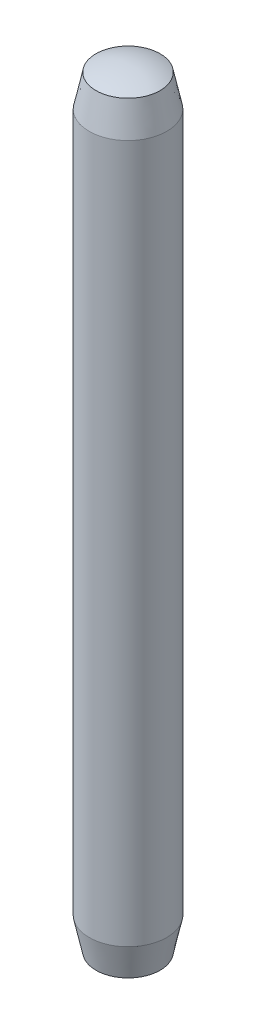
ISO-10303-21;
HEADER;
FILE_DESCRIPTION(('STEP AP214'),'2;1');
FILE_NAME('part.step','',(''),(''),'','','');
FILE_SCHEMA(('AUTOMOTIVE_DESIGN { 1 0 10303 214 1 1 1 1 }'));
ENDSEC;
DATA;
#1=APPLICATION_CONTEXT('core data for automotive mechanical design processes');
#2=APPLICATION_PROTOCOL_DEFINITION('international standard','automotive_design',2000,#1);
#3=PRODUCT_CONTEXT('',#1,'mechanical');
#4=PRODUCT('Part','Part','',(#3));
#5=PRODUCT_RELATED_PRODUCT_CATEGORY('part','',(#4));
#6=PRODUCT_DEFINITION_FORMATION('','',#4);
#7=PRODUCT_DEFINITION_CONTEXT('part definition',#1,'design');
#8=PRODUCT_DEFINITION('design','',#6,#7);
#9=PRODUCT_DEFINITION_SHAPE('','',#8);
#10=(LENGTH_UNIT() NAMED_UNIT(*) SI_UNIT(.MILLI.,.METRE.));
#11=(NAMED_UNIT(*) PLANE_ANGLE_UNIT() SI_UNIT($,.RADIAN.));
#12=(NAMED_UNIT(*) SI_UNIT($,.STERADIAN.) SOLID_ANGLE_UNIT());
#13=UNCERTAINTY_MEASURE_WITH_UNIT(LENGTH_MEASURE(1.E-05),#10,'distance_accuracy_value','');
#14=(GEOMETRIC_REPRESENTATION_CONTEXT(3) GLOBAL_UNCERTAINTY_ASSIGNED_CONTEXT((#13)) GLOBAL_UNIT_ASSIGNED_CONTEXT((#10,
#11,#12)) REPRESENTATION_CONTEXT('',''));
#15=CARTESIAN_POINT('',(0.,0.,0.));
#16=DIRECTION('',(0.,0.,1.));
#17=DIRECTION('',(1.,0.,0.));
#18=AXIS2_PLACEMENT_3D('',#15,#16,#17);
#19=CARTESIAN_POINT('',(0.,10.,0.));
#20=DIRECTION('',(0.,-1.,0.));
#21=DIRECTION('',(0.,0.,-1.));
#22=AXIS2_PLACEMENT_3D('',#19,#20,#21);
#23=CYLINDRICAL_SURFACE('',#22,0.5);
#24=CARTESIAN_POINT('',(0.,9.5,0.));
#25=DIRECTION('',(0.,-1.,0.));
#26=DIRECTION('',(1.,0.,0.));
#27=AXIS2_PLACEMENT_3D('',#24,#25,#26);
#28=CIRCLE('',#27,0.500000000000001);
#29=CARTESIAN_POINT('',(0.500000000000001,9.5,0.));
#30=VERTEX_POINT('',#29);
#31=EDGE_CURVE('E11',#30,#30,#28,.T.);
#32=ORIENTED_EDGE('',*,*,#31,.T.);
#33=EDGE_LOOP('',(#32));
#34=FACE_BOUND('',#33,.T.);
#35=CARTESIAN_POINT('',(0.,0.5,0.));
#36=DIRECTION('',(0.,-1.,0.));
#37=DIRECTION('',(1.,0.,0.));
#38=AXIS2_PLACEMENT_3D('',#35,#36,#37);
#39=CIRCLE('',#38,0.500000000000001);
#40=CARTESIAN_POINT('',(0.500000000000001,0.5,0.));
#41=VERTEX_POINT('',#40);
#42=EDGE_CURVE('E55',#41,#41,#39,.T.);
#43=ORIENTED_EDGE('',*,*,#42,.F.);
#44=EDGE_LOOP('',(#43));
#45=FACE_BOUND('',#44,.T.);
#46=ADVANCED_FACE('F33',(#34,#45),#23,.T.);
#47=CARTESIAN_POINT('',(0.,9.5,0.));
#48=DIRECTION('',(0.,-1.,0.));
#49=DIRECTION('',(1.,0.,0.));
#50=AXIS2_PLACEMENT_3D('',#47,#48,#49);
#51=CONICAL_SURFACE('',#50,0.500000000000001,0.209439510239313);
#52=CARTESIAN_POINT('',(0.,9.91088329307542,0.));
#53=DIRECTION('',(0.,-1.,0.));
#54=DIRECTION('',(1.,0.,0.));
#55=AXIS2_PLACEMENT_3D('',#52,#53,#54);
#56=CIRCLE('',#55,0.412664059976236);
#57=CARTESIAN_POINT('',(0.412664059976236,9.91088329307542,0.));
#58=VERTEX_POINT('',#57);
#59=EDGE_CURVE('E40',#58,#58,#56,.T.);
#60=ORIENTED_EDGE('',*,*,#59,.T.);
#61=EDGE_LOOP('',(#60));
#62=FACE_BOUND('',#61,.T.);
#63=ORIENTED_EDGE('',*,*,#31,.F.);
#64=EDGE_LOOP('',(#63));
#65=FACE_BOUND('',#64,.T.);
#66=ADVANCED_FACE('F50',(#62,#65),#51,.T.);
#67=CARTESIAN_POINT('',(0.,9.,0.));
#68=DIRECTION('',(0.,-1.,0.));
#69=DIRECTION('',(1.,0.,0.));
#70=AXIS2_PLACEMENT_3D('',#67,#68,#69);
#71=SPHERICAL_SURFACE('',#70,0.999999999999999);
#72=CARTESIAN_POINT('',(0.,10.,0.));
#73=VERTEX_POINT('',#72);
#74=VERTEX_LOOP('',#73);
#75=FACE_BOUND('',#74,.T.);
#76=ORIENTED_EDGE('',*,*,#59,.F.);
#77=EDGE_LOOP('',(#76));
#78=FACE_BOUND('',#77,.T.);
#79=ADVANCED_FACE('F46',(#75,#78),#71,.T.);
#80=CARTESIAN_POINT('',(0.,0.0891167069245764,0.));
#81=DIRECTION('',(0.,1.,0.));
#82=DIRECTION('',(-1.,0.,0.));
#83=AXIS2_PLACEMENT_3D('',#80,#81,#82);
#84=CONICAL_SURFACE('',#83,0.412664059976236,0.209439510239313);
#85=ORIENTED_EDGE('',*,*,#42,.T.);
#86=EDGE_LOOP('',(#85));
#87=FACE_BOUND('',#86,.T.);
#88=CARTESIAN_POINT('',(0.,0.0891167069245764,0.));
#89=DIRECTION('',(0.,-1.,0.));
#90=DIRECTION('',(1.,0.,0.));
#91=AXIS2_PLACEMENT_3D('',#88,#89,#90);
#92=CIRCLE('',#91,0.412664059976236);
#93=CARTESIAN_POINT('',(0.412664059976236,0.0891167069245764,0.));
#94=VERTEX_POINT('',#93);
#95=EDGE_CURVE('E57',#94,#94,#92,.T.);
#96=ORIENTED_EDGE('',*,*,#95,.F.);
#97=EDGE_LOOP('',(#96));
#98=FACE_BOUND('',#97,.T.);
#99=ADVANCED_FACE('F49',(#87,#98),#84,.T.);
#100=CARTESIAN_POINT('',(0.,1.,0.));
#101=DIRECTION('',(0.,-1.,0.));
#102=DIRECTION('',(1.,0.,0.));
#103=AXIS2_PLACEMENT_3D('',#100,#101,#102);
#104=SPHERICAL_SURFACE('',#103,1.);
#105=CARTESIAN_POINT('',(0.,0.,0.));
#106=VERTEX_POINT('',#105);
#107=VERTEX_LOOP('',#106);
#108=FACE_BOUND('',#107,.T.);
#109=ORIENTED_EDGE('',*,*,#95,.T.);
#110=EDGE_LOOP('',(#109));
#111=FACE_BOUND('',#110,.T.);
#112=ADVANCED_FACE('F63',(#108,#111),#104,.T.);
#113=CLOSED_SHELL('',(#46,#66,#79,#99,#112));
#114=MANIFOLD_SOLID_BREP('B2',#113);
#115=ADVANCED_BREP_SHAPE_REPRESENTATION('',(#18,#114),#14);
#116=SHAPE_DEFINITION_REPRESENTATION(#9,#115);
ENDSEC;
END-ISO-10303-21;
